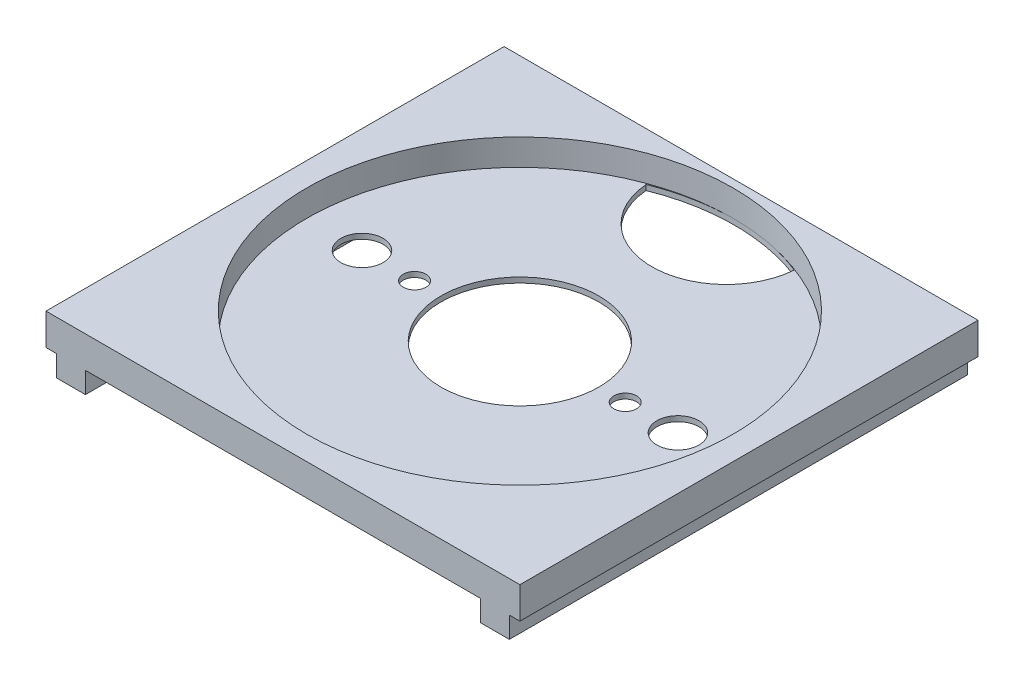
ISO-10303-21;
HEADER;
FILE_DESCRIPTION(('STEP AP214'),'2;1');
FILE_NAME('part.step','',(''),(''),'','','');
FILE_SCHEMA(('AUTOMOTIVE_DESIGN { 1 0 10303 214 1 1 1 1 }'));
ENDSEC;
DATA;
#1=APPLICATION_CONTEXT('core data for automotive mechanical design processes');
#2=APPLICATION_PROTOCOL_DEFINITION('international standard','automotive_design',2000,#1);
#3=PRODUCT_CONTEXT('',#1,'mechanical');
#4=PRODUCT('Part','Part','',(#3));
#5=PRODUCT_RELATED_PRODUCT_CATEGORY('part','',(#4));
#6=PRODUCT_DEFINITION_FORMATION('','',#4);
#7=PRODUCT_DEFINITION_CONTEXT('part definition',#1,'design');
#8=PRODUCT_DEFINITION('design','',#6,#7);
#9=PRODUCT_DEFINITION_SHAPE('','',#8);
#10=(LENGTH_UNIT() NAMED_UNIT(*) SI_UNIT(.MILLI.,.METRE.));
#11=(NAMED_UNIT(*) PLANE_ANGLE_UNIT() SI_UNIT($,.RADIAN.));
#12=(NAMED_UNIT(*) SI_UNIT($,.STERADIAN.) SOLID_ANGLE_UNIT());
#13=UNCERTAINTY_MEASURE_WITH_UNIT(LENGTH_MEASURE(1.E-05),#10,'distance_accuracy_value','');
#14=(GEOMETRIC_REPRESENTATION_CONTEXT(3) GLOBAL_UNCERTAINTY_ASSIGNED_CONTEXT((#13)) GLOBAL_UNIT_ASSIGNED_CONTEXT((#10,
#11,#12)) REPRESENTATION_CONTEXT('',''));
#15=CARTESIAN_POINT('',(0.,0.,0.));
#16=DIRECTION('',(0.,0.,1.));
#17=DIRECTION('',(1.,0.,0.));
#18=AXIS2_PLACEMENT_3D('',#15,#16,#17);
#19=CARTESIAN_POINT('',(0.,5.,0.));
#20=DIRECTION('',(0.,1.,0.));
#21=DIRECTION('',(0.,0.,1.));
#22=AXIS2_PLACEMENT_3D('',#19,#20,#21);
#23=CYLINDRICAL_SURFACE('',#22,40.5);
#24=CARTESIAN_POINT('',(0.,5.,0.));
#25=DIRECTION('',(0.,1.,0.));
#26=DIRECTION('',(0.,0.,1.));
#27=AXIS2_PLACEMENT_3D('',#24,#25,#26);
#28=CIRCLE('',#27,40.5);
#29=CARTESIAN_POINT('',(7.96690062199776,5.,-39.7086702683332));
#30=VERTEX_POINT('',#29);
#31=CARTESIAN_POINT('',(-0.453204015702651,5.,-40.4974641937017));
#32=VERTEX_POINT('',#31);
#33=EDGE_CURVE('E285',#30,#32,#28,.T.);
#34=ORIENTED_EDGE('',*,*,#33,.F.);
#35=EDGE_CURVE('E202',#32,#30,#28,.T.);
#36=ORIENTED_EDGE('',*,*,#35,.F.);
#37=EDGE_LOOP('',(#34,#36));
#38=FACE_BOUND('',#37,.T.);
#39=CARTESIAN_POINT('',(0.,10.,0.));
#40=DIRECTION('',(0.,1.,0.));
#41=DIRECTION('',(0.,0.,1.));
#42=AXIS2_PLACEMENT_3D('',#39,#40,#41);
#43=CIRCLE('',#42,40.5);
#44=CARTESIAN_POINT('',(0.,10.,40.5));
#45=VERTEX_POINT('',#44);
#46=EDGE_CURVE('E169',#45,#45,#43,.T.);
#47=ORIENTED_EDGE('',*,*,#46,.T.);
#48=EDGE_LOOP('',(#47));
#49=FACE_BOUND('',#48,.T.);
#50=ADVANCED_FACE('F41',(#38,#49),#23,.F.);
#51=CARTESIAN_POINT('',(20.,3.,0.));
#52=DIRECTION('',(0.,1.,0.));
#53=DIRECTION('',(0.,0.,1.));
#54=AXIS2_PLACEMENT_3D('',#51,#52,#53);
#55=CYLINDRICAL_SURFACE('',#54,2.15);
#56=CARTESIAN_POINT('',(20.,5.,0.));
#57=DIRECTION('',(0.,1.,0.));
#58=DIRECTION('',(0.,0.,1.));
#59=AXIS2_PLACEMENT_3D('',#56,#57,#58);
#60=CIRCLE('',#59,2.15);
#61=CARTESIAN_POINT('',(20.,5.,2.15));
#62=VERTEX_POINT('',#61);
#63=EDGE_CURVE('E294',#62,#62,#60,.T.);
#64=ORIENTED_EDGE('',*,*,#63,.T.);
#65=EDGE_LOOP('',(#64));
#66=FACE_BOUND('',#65,.T.);
#67=CARTESIAN_POINT('',(20.,4.,0.));
#68=DIRECTION('',(0.,-1.,0.));
#69=DIRECTION('',(0.,0.,-1.));
#70=AXIS2_PLACEMENT_3D('',#67,#68,#69);
#71=CIRCLE('',#70,2.15);
#72=CARTESIAN_POINT('',(20.,4.,-2.15));
#73=VERTEX_POINT('',#72);
#74=EDGE_CURVE('E268',#73,#73,#71,.F.);
#75=ORIENTED_EDGE('',*,*,#74,.F.);
#76=EDGE_LOOP('',(#75));
#77=FACE_BOUND('',#76,.T.);
#78=ADVANCED_FACE('F355',(#66,#77),#55,.F.);
#79=CARTESIAN_POINT('',(-20.,3.,0.));
#80=DIRECTION('',(0.,1.,0.));
#81=DIRECTION('',(0.,0.,1.));
#82=AXIS2_PLACEMENT_3D('',#79,#80,#81);
#83=CYLINDRICAL_SURFACE('',#82,2.15);
#84=CARTESIAN_POINT('',(-20.,5.,0.));
#85=DIRECTION('',(0.,1.,0.));
#86=DIRECTION('',(0.,0.,1.));
#87=AXIS2_PLACEMENT_3D('',#84,#85,#86);
#88=CIRCLE('',#87,2.15);
#89=CARTESIAN_POINT('',(-20.,5.,2.15));
#90=VERTEX_POINT('',#89);
#91=EDGE_CURVE('E291',#90,#90,#88,.T.);
#92=ORIENTED_EDGE('',*,*,#91,.T.);
#93=EDGE_LOOP('',(#92));
#94=FACE_BOUND('',#93,.T.);
#95=CARTESIAN_POINT('',(-20.,4.,0.));
#96=DIRECTION('',(0.,-1.,0.));
#97=DIRECTION('',(0.,0.,-1.));
#98=AXIS2_PLACEMENT_3D('',#95,#96,#97);
#99=CIRCLE('',#98,2.15);
#100=CARTESIAN_POINT('',(-20.,4.,-2.15));
#101=VERTEX_POINT('',#100);
#102=EDGE_CURVE('E206',#101,#101,#99,.F.);
#103=ORIENTED_EDGE('',*,*,#102,.F.);
#104=EDGE_LOOP('',(#103));
#105=FACE_BOUND('',#104,.T.);
#106=ADVANCED_FACE('F541',(#94,#105),#83,.F.);
#107=CARTESIAN_POINT('',(0.,0.,0.));
#108=DIRECTION('',(0.,1.,0.));
#109=DIRECTION('',(0.,0.,1.));
#110=AXIS2_PLACEMENT_3D('',#107,#108,#109);
#111=CYLINDRICAL_SURFACE('',#110,15.);
#112=CARTESIAN_POINT('',(0.,5.,0.));
#113=DIRECTION('',(0.,1.,0.));
#114=DIRECTION('',(0.,0.,1.));
#115=AXIS2_PLACEMENT_3D('',#112,#113,#114);
#116=CIRCLE('',#115,15.);
#117=CARTESIAN_POINT('',(0.,5.,15.));
#118=VERTEX_POINT('',#117);
#119=EDGE_CURVE('E288',#118,#118,#116,.T.);
#120=ORIENTED_EDGE('',*,*,#119,.T.);
#121=EDGE_LOOP('',(#120));
#122=FACE_BOUND('',#121,.T.);
#123=CARTESIAN_POINT('',(0.,4.,0.));
#124=DIRECTION('',(0.,-1.,0.));
#125=DIRECTION('',(0.,0.,-1.));
#126=AXIS2_PLACEMENT_3D('',#123,#124,#125);
#127=CIRCLE('',#126,15.);
#128=CARTESIAN_POINT('',(0.,4.,-15.));
#129=VERTEX_POINT('',#128);
#130=EDGE_CURVE('E203',#129,#129,#127,.F.);
#131=ORIENTED_EDGE('',*,*,#130,.F.);
#132=EDGE_LOOP('',(#131));
#133=FACE_BOUND('',#132,.T.);
#134=ADVANCED_FACE('F376',(#122,#133),#111,.F.);
#135=CARTESIAN_POINT('',(30.0323396507021,-5.,0.0225134709915971));
#136=DIRECTION('',(0.,1.,0.));
#137=DIRECTION('',(0.,0.,1.));
#138=AXIS2_PLACEMENT_3D('',#135,#136,#137);
#139=CYLINDRICAL_SURFACE('',#138,4.00000000000001);
#140=CARTESIAN_POINT('',(30.0323396507021,4.,0.0225134709915971));
#141=DIRECTION('',(0.,-1.,0.));
#142=DIRECTION('',(0.,0.,-1.));
#143=AXIS2_PLACEMENT_3D('',#140,#141,#142);
#144=CIRCLE('',#143,4.00000000000001);
#145=CARTESIAN_POINT('',(30.0323396507021,4.,-3.97748652900842));
#146=VERTEX_POINT('',#145);
#147=EDGE_CURVE('E212',#146,#146,#144,.T.);
#148=ORIENTED_EDGE('',*,*,#147,.T.);
#149=EDGE_LOOP('',(#148));
#150=FACE_BOUND('',#149,.T.);
#151=CARTESIAN_POINT('',(30.0323396507021,5.,0.0225134709915971));
#152=DIRECTION('',(0.,1.,0.));
#153=DIRECTION('',(0.,0.,1.));
#154=AXIS2_PLACEMENT_3D('',#151,#152,#153);
#155=CIRCLE('',#154,4.00000000000001);
#156=CARTESIAN_POINT('',(30.0323396507021,5.,4.02251347099161));
#157=VERTEX_POINT('',#156);
#158=EDGE_CURVE('E208',#157,#157,#155,.T.);
#159=ORIENTED_EDGE('',*,*,#158,.T.);
#160=EDGE_LOOP('',(#159));
#161=FACE_BOUND('',#160,.T.);
#162=ADVANCED_FACE('F322',(#150,#161),#139,.F.);
#163=CARTESIAN_POINT('',(0.234545087504077,5.,-20.721427314011));
#164=DIRECTION('',(0.,1.,0.));
#165=DIRECTION('',(0.,0.,1.));
#166=AXIS2_PLACEMENT_3D('',#163,#164,#165);
#167=PLANE('',#166);
#168=CARTESIAN_POINT('',(0.234545087504078,5.,-2.50368837224554));
#169=DIRECTION('',(0.,-1.,0.));
#170=DIRECTION('',(0.,0.,-1.));
#171=AXIS2_PLACEMENT_3D('',#168,#169,#170);
#172=CIRCLE('',#171,38.0000000000004);
#173=EDGE_CURVE('E211',#32,#30,#172,.T.);
#174=ORIENTED_EDGE('',*,*,#173,.T.);
#175=ORIENTED_EDGE('',*,*,#33,.T.);
#176=EDGE_LOOP('',(#174,#175));
#177=FACE_BOUND('',#176,.T.);
#178=ADVANCED_FACE('F351',(#177),#167,.F.);
#179=CARTESIAN_POINT('',(0.,5.,0.));
#180=DIRECTION('',(0.,1.,0.));
#181=DIRECTION('',(0.,0.,1.));
#182=AXIS2_PLACEMENT_3D('',#179,#180,#181);
#183=PLANE('',#182);
#184=CARTESIAN_POINT('',(-29.9676603492979,5.,0.0225134709915971));
#185=DIRECTION('',(0.,1.,0.));
#186=DIRECTION('',(0.,0.,1.));
#187=AXIS2_PLACEMENT_3D('',#184,#185,#186);
#188=CIRCLE('',#187,4.);
#189=CARTESIAN_POINT('',(-29.9676603492979,5.,4.0225134709916));
#190=VERTEX_POINT('',#189);
#191=EDGE_CURVE('E213',#190,#190,#188,.T.);
#192=ORIENTED_EDGE('',*,*,#191,.F.);
#193=EDGE_LOOP('',(#192));
#194=FACE_BOUND('',#193,.T.);
#195=ORIENTED_EDGE('',*,*,#158,.F.);
#196=EDGE_LOOP('',(#195));
#197=FACE_BOUND('',#196,.T.);
#198=ORIENTED_EDGE('',*,*,#119,.F.);
#199=EDGE_LOOP('',(#198));
#200=FACE_BOUND('',#199,.T.);
#201=ORIENTED_EDGE('',*,*,#91,.F.);
#202=EDGE_LOOP('',(#201));
#203=FACE_BOUND('',#202,.T.);
#204=ORIENTED_EDGE('',*,*,#63,.F.);
#205=EDGE_LOOP('',(#204));
#206=FACE_BOUND('',#205,.T.);
#207=CARTESIAN_POINT('',(0.234545087504076,5.,-38.9391662557764));
#208=DIRECTION('',(0.,1.,0.));
#209=DIRECTION('',(0.,0.,1.));
#210=AXIS2_PLACEMENT_3D('',#207,#208,#209);
#211=CIRCLE('',#210,14.1220477581371);
#212=CARTESIAN_POINT('',(-13.8415216151434,5.,-37.800491997824));
#213=VERTEX_POINT('',#212);
#214=CARTESIAN_POINT('',(14.3106117901516,5.,-37.800491997824));
#215=VERTEX_POINT('',#214);
#216=EDGE_CURVE('E278',#213,#215,#211,.T.);
#217=ORIENTED_EDGE('',*,*,#216,.F.);
#218=EDGE_CURVE('E282',#213,#32,#172,.T.);
#219=ORIENTED_EDGE('',*,*,#218,.T.);
#220=ORIENTED_EDGE('',*,*,#35,.T.);
#221=CARTESIAN_POINT('',(0.234545087504078,5.,-2.50368837224554));
#222=DIRECTION('',(0.,1.,0.));
#223=DIRECTION('',(0.,0.,1.));
#224=AXIS2_PLACEMENT_3D('',#221,#222,#223);
#225=CIRCLE('',#224,38.0000000000004);
#226=EDGE_CURVE('E198',#30,#215,#225,.F.);
#227=ORIENTED_EDGE('',*,*,#226,.T.);
#228=EDGE_LOOP('',(#217,#219,#220,#227));
#229=FACE_BOUND('',#228,.T.);
#230=ADVANCED_FACE('F345',(#194,#197,#200,#203,#206,#229),#183,.T.);
#231=CARTESIAN_POINT('',(0.234545087504078,-61.,-2.50368837224554));
#232=DIRECTION('',(0.,1.,0.));
#233=DIRECTION('',(0.,0.,1.));
#234=AXIS2_PLACEMENT_3D('',#231,#232,#233);
#235=CYLINDRICAL_SURFACE('',#234,38.0000000000004);
#236=DIRECTION('',(0.,1.,0.));
#237=VECTOR('',#236,1.);
#238=CARTESIAN_POINT('',(-13.8415216151434,-61.,-37.800491997824));
#239=LINE('',#238,#237);
#240=CARTESIAN_POINT('',(-13.8415216151434,4.00000000000007,-37.800491997824));
#241=VERTEX_POINT('',#240);
#242=EDGE_CURVE('E281',#241,#213,#239,.T.);
#243=ORIENTED_EDGE('',*,*,#242,.F.);
#244=CARTESIAN_POINT('',(0.234545087504078,4.00000000000012,-2.50368837224554));
#245=DIRECTION('',(0.,-1.,0.));
#246=DIRECTION('',(1.,0.,0.));
#247=AXIS2_PLACEMENT_3D('',#244,#245,#246);
#248=CIRCLE('',#247,38.0000000000004);
#249=CARTESIAN_POINT('',(14.3106117901516,4.00000000000025,-37.800491997824));
#250=VERTEX_POINT('',#249);
#251=EDGE_CURVE('E201',#241,#250,#248,.T.);
#252=ORIENTED_EDGE('',*,*,#251,.T.);
#253=DIRECTION('',(0.,1.,0.));
#254=VECTOR('',#253,1.);
#255=CARTESIAN_POINT('',(14.3106117901516,-61.,-37.800491997824));
#256=LINE('',#255,#254);
#257=EDGE_CURVE('E222',#250,#215,#256,.T.);
#258=ORIENTED_EDGE('',*,*,#257,.T.);
#259=ORIENTED_EDGE('',*,*,#226,.F.);
#260=ORIENTED_EDGE('',*,*,#173,.F.);
#261=ORIENTED_EDGE('',*,*,#218,.F.);
#262=EDGE_LOOP('',(#243,#252,#258,#259,#260,#261));
#263=FACE_BOUND('',#262,.T.);
#264=ADVANCED_FACE('F339',(#263),#235,.F.);
#265=CARTESIAN_POINT('',(0.234545087504076,-61.,-38.9391662557764));
#266=DIRECTION('',(0.,1.,0.));
#267=DIRECTION('',(0.,0.,1.));
#268=AXIS2_PLACEMENT_3D('',#265,#266,#267);
#269=CYLINDRICAL_SURFACE('',#268,14.1220477581371);
#270=CARTESIAN_POINT('',(0.234545087504076,4.00000000000012,-38.9391662557764));
#271=DIRECTION('',(0.,-1.,0.));
#272=DIRECTION('',(1.,0.,0.));
#273=AXIS2_PLACEMENT_3D('',#270,#271,#272);
#274=CIRCLE('',#273,14.1220477581371);
#275=EDGE_CURVE('E217',#241,#250,#274,.F.);
#276=ORIENTED_EDGE('',*,*,#275,.F.);
#277=ORIENTED_EDGE('',*,*,#242,.T.);
#278=ORIENTED_EDGE('',*,*,#216,.T.);
#279=ORIENTED_EDGE('',*,*,#257,.F.);
#280=EDGE_LOOP('',(#276,#277,#278,#279));
#281=FACE_BOUND('',#280,.T.);
#282=ADVANCED_FACE('F341',(#281),#269,.F.);
#283=CARTESIAN_POINT('',(-29.9676603492979,-5.,0.0225134709915971));
#284=DIRECTION('',(0.,1.,0.));
#285=DIRECTION('',(0.,0.,1.));
#286=AXIS2_PLACEMENT_3D('',#283,#284,#285);
#287=CYLINDRICAL_SURFACE('',#286,4.);
#288=CARTESIAN_POINT('',(-29.9676603492979,4.,0.0225134709915971));
#289=DIRECTION('',(0.,-1.,0.));
#290=DIRECTION('',(0.,0.,-1.));
#291=AXIS2_PLACEMENT_3D('',#288,#289,#290);
#292=CIRCLE('',#291,4.);
#293=CARTESIAN_POINT('',(-29.9676603492979,4.,-3.9774865290084));
#294=VERTEX_POINT('',#293);
#295=EDGE_CURVE('E216',#294,#294,#292,.T.);
#296=ORIENTED_EDGE('',*,*,#295,.T.);
#297=EDGE_LOOP('',(#296));
#298=FACE_BOUND('',#297,.T.);
#299=ORIENTED_EDGE('',*,*,#191,.T.);
#300=EDGE_LOOP('',(#299));
#301=FACE_BOUND('',#300,.T.);
#302=ADVANCED_FACE('F360',(#298,#301),#287,.F.);
#303=CARTESIAN_POINT('',(0.,10.,0.));
#304=DIRECTION('',(0.,-1.,0.));
#305=DIRECTION('',(0.,0.,-1.));
#306=AXIS2_PLACEMENT_3D('',#303,#304,#305);
#307=PLANE('',#306);
#308=ORIENTED_EDGE('',*,*,#46,.F.);
#309=EDGE_LOOP('',(#308));
#310=FACE_BOUND('',#309,.T.);
#311=DIRECTION('',(0.,0.,-1.));
#312=VECTOR('',#311,1.);
#313=CARTESIAN_POINT('',(45.,10.,-45.));
#314=LINE('',#313,#312);
#315=CARTESIAN_POINT('',(45.,10.,45.));
#316=VERTEX_POINT('',#315);
#317=CARTESIAN_POINT('',(45.,10.,-42.));
#318=VERTEX_POINT('',#317);
#319=EDGE_CURVE('E177',#316,#318,#314,.T.);
#320=ORIENTED_EDGE('',*,*,#319,.T.);
#321=DIRECTION('',(-1.,0.,0.));
#322=VECTOR('',#321,1.);
#323=CARTESIAN_POINT('',(45.,10.,-42.));
#324=LINE('',#323,#322);
#325=CARTESIAN_POINT('',(-45.,10.,-42.));
#326=VERTEX_POINT('',#325);
#327=EDGE_CURVE('E159',#318,#326,#324,.T.);
#328=ORIENTED_EDGE('',*,*,#327,.T.);
#329=DIRECTION('',(0.,0.,1.));
#330=VECTOR('',#329,1.);
#331=CARTESIAN_POINT('',(-45.,10.,45.));
#332=LINE('',#331,#330);
#333=CARTESIAN_POINT('',(-45.,10.,45.));
#334=VERTEX_POINT('',#333);
#335=EDGE_CURVE('E189',#326,#334,#332,.T.);
#336=ORIENTED_EDGE('',*,*,#335,.T.);
#337=DIRECTION('',(1.,0.,0.));
#338=VECTOR('',#337,1.);
#339=CARTESIAN_POINT('',(0.,10.,45.));
#340=LINE('',#339,#338);
#341=EDGE_CURVE('E183',#334,#316,#340,.T.);
#342=ORIENTED_EDGE('',*,*,#341,.T.);
#343=EDGE_LOOP('',(#320,#328,#336,#342));
#344=FACE_BOUND('',#343,.T.);
#345=ADVANCED_FACE('F181',(#310,#344),#307,.F.);
#346=CARTESIAN_POINT('',(-45.,10.,45.));
#347=DIRECTION('',(1.,0.,0.));
#348=DIRECTION('',(0.,0.,-1.));
#349=AXIS2_PLACEMENT_3D('',#346,#347,#348);
#350=PLANE('',#349);
#351=ORIENTED_EDGE('',*,*,#335,.F.);
#352=DIRECTION('',(0.,1.,0.));
#353=VECTOR('',#352,1.);
#354=CARTESIAN_POINT('',(-45.,0.,-42.));
#355=LINE('',#354,#353);
#356=CARTESIAN_POINT('',(-45.,4.,-42.));
#357=VERTEX_POINT('',#356);
#358=EDGE_CURVE('E165',#357,#326,#355,.T.);
#359=ORIENTED_EDGE('',*,*,#358,.F.);
#360=DIRECTION('',(0.,0.,1.));
#361=VECTOR('',#360,1.);
#362=CARTESIAN_POINT('',(-45.,4.,-42.));
#363=LINE('',#362,#361);
#364=CARTESIAN_POINT('',(-45.,4.,45.));
#365=VERTEX_POINT('',#364);
#366=EDGE_CURVE('E185',#357,#365,#363,.T.);
#367=ORIENTED_EDGE('',*,*,#366,.T.);
#368=DIRECTION('',(0.,-1.,0.));
#369=VECTOR('',#368,1.);
#370=CARTESIAN_POINT('',(-45.,10.,45.));
#371=LINE('',#370,#369);
#372=EDGE_CURVE('E194',#334,#365,#371,.T.);
#373=ORIENTED_EDGE('',*,*,#372,.F.);
#374=EDGE_LOOP('',(#351,#359,#367,#373));
#375=FACE_BOUND('',#374,.T.);
#376=ADVANCED_FACE('F301',(#375),#350,.F.);
#377=CARTESIAN_POINT('',(45.,10.,-45.));
#378=DIRECTION('',(-1.,0.,0.));
#379=DIRECTION('',(0.,0.,1.));
#380=AXIS2_PLACEMENT_3D('',#377,#378,#379);
#381=PLANE('',#380);
#382=DIRECTION('',(0.,0.,1.));
#383=VECTOR('',#382,1.);
#384=CARTESIAN_POINT('',(45.,4.00000000000032,-42.));
#385=LINE('',#384,#383);
#386=CARTESIAN_POINT('',(45.,4.00000000000031,-42.));
#387=VERTEX_POINT('',#386);
#388=CARTESIAN_POINT('',(45.,4.00000000000032,45.));
#389=VERTEX_POINT('',#388);
#390=EDGE_CURVE('E178',#387,#389,#385,.T.);
#391=ORIENTED_EDGE('',*,*,#390,.F.);
#392=DIRECTION('',(0.,1.,0.));
#393=VECTOR('',#392,1.);
#394=CARTESIAN_POINT('',(45.,0.,-42.));
#395=LINE('',#394,#393);
#396=EDGE_CURVE('E162',#387,#318,#395,.T.);
#397=ORIENTED_EDGE('',*,*,#396,.T.);
#398=ORIENTED_EDGE('',*,*,#319,.F.);
#399=DIRECTION('',(0.,-1.,0.));
#400=VECTOR('',#399,1.);
#401=CARTESIAN_POINT('',(45.,10.,45.));
#402=LINE('',#401,#400);
#403=EDGE_CURVE('E187',#316,#389,#402,.T.);
#404=ORIENTED_EDGE('',*,*,#403,.T.);
#405=EDGE_LOOP('',(#391,#397,#398,#404));
#406=FACE_BOUND('',#405,.T.);
#407=ADVANCED_FACE('F175',(#406),#381,.F.);
#408=CARTESIAN_POINT('',(45.,10.,45.));
#409=DIRECTION('',(0.,0.,-1.));
#410=DIRECTION('',(-1.,0.,0.));
#411=AXIS2_PLACEMENT_3D('',#408,#409,#410);
#412=PLANE('',#411);
#413=ORIENTED_EDGE('',*,*,#372,.T.);
#414=DIRECTION('',(-1.,0.,0.));
#415=VECTOR('',#414,1.);
#416=CARTESIAN_POINT('',(-43.,4.,45.));
#417=LINE('',#416,#415);
#418=CARTESIAN_POINT('',(-43.,4.,45.));
#419=VERTEX_POINT('',#418);
#420=EDGE_CURVE('E96',#419,#365,#417,.T.);
#421=ORIENTED_EDGE('',*,*,#420,.F.);
#422=DIRECTION('',(0.,-1.,0.));
#423=VECTOR('',#422,1.);
#424=CARTESIAN_POINT('',(-43.,4.,45.));
#425=LINE('',#424,#423);
#426=CARTESIAN_POINT('',(-43.,0.,45.));
#427=VERTEX_POINT('',#426);
#428=EDGE_CURVE('E197',#419,#427,#425,.T.);
#429=ORIENTED_EDGE('',*,*,#428,.T.);
#430=DIRECTION('',(1.,0.,0.));
#431=VECTOR('',#430,1.);
#432=CARTESIAN_POINT('',(-43.,0.,45.));
#433=LINE('',#432,#431);
#434=CARTESIAN_POINT('',(-37.5165528603111,0.,45.));
#435=VERTEX_POINT('',#434);
#436=EDGE_CURVE('E244',#427,#435,#433,.T.);
#437=ORIENTED_EDGE('',*,*,#436,.T.);
#438=DIRECTION('',(0.,1.,0.));
#439=VECTOR('',#438,1.);
#440=CARTESIAN_POINT('',(-37.5165528603111,0.,45.));
#441=LINE('',#440,#439);
#442=CARTESIAN_POINT('',(-37.5165528603111,4.,45.));
#443=VERTEX_POINT('',#442);
#444=EDGE_CURVE('E247',#435,#443,#441,.T.);
#445=ORIENTED_EDGE('',*,*,#444,.T.);
#446=DIRECTION('',(1.,0.,0.));
#447=VECTOR('',#446,1.);
#448=CARTESIAN_POINT('',(-37.5165528603111,4.,45.));
#449=LINE('',#448,#447);
#450=CARTESIAN_POINT('',(37.5165528603111,4.00000000000026,45.));
#451=VERTEX_POINT('',#450);
#452=EDGE_CURVE('E250',#443,#451,#449,.T.);
#453=ORIENTED_EDGE('',*,*,#452,.T.);
#454=DIRECTION('',(0.,1.,0.));
#455=VECTOR('',#454,1.);
#456=CARTESIAN_POINT('',(37.5165528603112,2.60208521396521E-13,45.));
#457=LINE('',#456,#455);
#458=CARTESIAN_POINT('',(37.5165528603112,2.60208521396521E-13,45.));
#459=VERTEX_POINT('',#458);
#460=EDGE_CURVE('E229',#459,#451,#457,.T.);
#461=ORIENTED_EDGE('',*,*,#460,.F.);
#462=DIRECTION('',(-1.,0.,0.));
#463=VECTOR('',#462,1.);
#464=CARTESIAN_POINT('',(43.,2.98372437868011E-13,45.));
#465=LINE('',#464,#463);
#466=CARTESIAN_POINT('',(43.,2.98372437868011E-13,45.));
#467=VERTEX_POINT('',#466);
#468=EDGE_CURVE('E225',#467,#459,#465,.T.);
#469=ORIENTED_EDGE('',*,*,#468,.F.);
#470=DIRECTION('',(0.,-1.,0.));
#471=VECTOR('',#470,1.);
#472=CARTESIAN_POINT('',(43.,4.0000000000003,45.));
#473=LINE('',#472,#471);
#474=CARTESIAN_POINT('',(43.,4.0000000000003,45.));
#475=VERTEX_POINT('',#474);
#476=EDGE_CURVE('E226',#475,#467,#473,.T.);
#477=ORIENTED_EDGE('',*,*,#476,.F.);
#478=DIRECTION('',(1.,0.,0.));
#479=VECTOR('',#478,1.);
#480=CARTESIAN_POINT('',(43.,4.0000000000003,45.));
#481=LINE('',#480,#479);
#482=EDGE_CURVE('E207',#475,#389,#481,.T.);
#483=ORIENTED_EDGE('',*,*,#482,.T.);
#484=ORIENTED_EDGE('',*,*,#403,.F.);
#485=ORIENTED_EDGE('',*,*,#341,.F.);
#486=EDGE_LOOP('',(#413,#421,#429,#437,#445,#453,#461,#469,#477,#483,#484,#485));
#487=FACE_BOUND('',#486,.T.);
#488=ADVANCED_FACE('F303',(#487),#412,.F.);
#489=CARTESIAN_POINT('',(-35.,4.,-23.));
#490=DIRECTION('',(0.,-1.,0.));
#491=DIRECTION('',(0.,0.,-1.));
#492=AXIS2_PLACEMENT_3D('',#489,#490,#491);
#493=PLANE('',#492);
#494=DIRECTION('',(0.,0.,1.));
#495=VECTOR('',#494,1.);
#496=CARTESIAN_POINT('',(37.5165528603111,4.00000000000026,-42.));
#497=LINE('',#496,#495);
#498=CARTESIAN_POINT('',(37.5165528603111,4.,-42.));
#499=VERTEX_POINT('',#498);
#500=EDGE_CURVE('E219',#499,#451,#497,.T.);
#501=ORIENTED_EDGE('',*,*,#500,.T.);
#502=ORIENTED_EDGE('',*,*,#452,.F.);
#503=DIRECTION('',(0.,0.,1.));
#504=VECTOR('',#503,1.);
#505=CARTESIAN_POINT('',(-37.5165528603111,4.,-42.));
#506=LINE('',#505,#504);
#507=CARTESIAN_POINT('',(-37.5165528603111,4.,-42.));
#508=VERTEX_POINT('',#507);
#509=EDGE_CURVE('E236',#508,#443,#506,.T.);
#510=ORIENTED_EDGE('',*,*,#509,.F.);
#511=DIRECTION('',(1.,0.,0.));
#512=VECTOR('',#511,1.);
#513=CARTESIAN_POINT('',(-37.5165528603111,4.,-42.));
#514=LINE('',#513,#512);
#515=EDGE_CURVE('E235',#508,#499,#514,.T.);
#516=ORIENTED_EDGE('',*,*,#515,.T.);
#517=EDGE_LOOP('',(#501,#502,#510,#516));
#518=FACE_BOUND('',#517,.T.);
#519=ORIENTED_EDGE('',*,*,#295,.F.);
#520=EDGE_LOOP('',(#519));
#521=FACE_BOUND('',#520,.T.);
#522=ORIENTED_EDGE('',*,*,#147,.F.);
#523=EDGE_LOOP('',(#522));
#524=FACE_BOUND('',#523,.T.);
#525=ORIENTED_EDGE('',*,*,#130,.T.);
#526=EDGE_LOOP('',(#525));
#527=FACE_BOUND('',#526,.T.);
#528=ORIENTED_EDGE('',*,*,#102,.T.);
#529=EDGE_LOOP('',(#528));
#530=FACE_BOUND('',#529,.T.);
#531=ORIENTED_EDGE('',*,*,#74,.T.);
#532=EDGE_LOOP('',(#531));
#533=FACE_BOUND('',#532,.T.);
#534=ORIENTED_EDGE('',*,*,#275,.T.);
#535=ORIENTED_EDGE('',*,*,#251,.F.);
#536=EDGE_LOOP('',(#534,#535));
#537=FACE_BOUND('',#536,.T.);
#538=ADVANCED_FACE('F325',(#518,#521,#524,#527,#530,#533,#537),#493,.T.);
#539=CARTESIAN_POINT('',(43.,4.0000000000003,-42.));
#540=DIRECTION('',(0.,-1.,0.));
#541=DIRECTION('',(1.,0.,0.));
#542=AXIS2_PLACEMENT_3D('',#539,#540,#541);
#543=PLANE('',#542);
#544=ORIENTED_EDGE('',*,*,#482,.F.);
#545=DIRECTION('',(0.,0.,1.));
#546=VECTOR('',#545,1.);
#547=CARTESIAN_POINT('',(43.,4.0000000000003,-42.));
#548=LINE('',#547,#546);
#549=CARTESIAN_POINT('',(43.,4.0000000000003,-42.));
#550=VERTEX_POINT('',#549);
#551=EDGE_CURVE('E85',#550,#475,#548,.T.);
#552=ORIENTED_EDGE('',*,*,#551,.F.);
#553=DIRECTION('',(1.,0.,0.));
#554=VECTOR('',#553,1.);
#555=CARTESIAN_POINT('',(43.,4.0000000000003,-42.));
#556=LINE('',#555,#554);
#557=EDGE_CURVE('E45',#550,#387,#556,.T.);
#558=ORIENTED_EDGE('',*,*,#557,.T.);
#559=ORIENTED_EDGE('',*,*,#390,.T.);
#560=EDGE_LOOP('',(#544,#552,#558,#559));
#561=FACE_BOUND('',#560,.T.);
#562=ADVANCED_FACE('F307',(#561),#543,.T.);
#563=CARTESIAN_POINT('',(-43.,4.,-42.));
#564=DIRECTION('',(0.,1.,0.));
#565=DIRECTION('',(0.,0.,1.));
#566=AXIS2_PLACEMENT_3D('',#563,#564,#565);
#567=PLANE('',#566);
#568=ORIENTED_EDGE('',*,*,#420,.T.);
#569=ORIENTED_EDGE('',*,*,#366,.F.);
#570=DIRECTION('',(-1.,0.,0.));
#571=VECTOR('',#570,1.);
#572=CARTESIAN_POINT('',(-43.,4.,-42.));
#573=LINE('',#572,#571);
#574=CARTESIAN_POINT('',(-43.,4.,-42.));
#575=VERTEX_POINT('',#574);
#576=EDGE_CURVE('E259',#575,#357,#573,.T.);
#577=ORIENTED_EDGE('',*,*,#576,.F.);
#578=DIRECTION('',(0.,0.,1.));
#579=VECTOR('',#578,1.);
#580=CARTESIAN_POINT('',(-43.,4.,-42.));
#581=LINE('',#580,#579);
#582=EDGE_CURVE('E93',#575,#419,#581,.T.);
#583=ORIENTED_EDGE('',*,*,#582,.T.);
#584=EDGE_LOOP('',(#568,#569,#577,#583));
#585=FACE_BOUND('',#584,.T.);
#586=ADVANCED_FACE('F43',(#585),#567,.F.);
#587=CARTESIAN_POINT('',(43.,4.0000000000003,-42.));
#588=DIRECTION('',(-1.,0.,0.));
#589=DIRECTION('',(0.,-1.,0.));
#590=AXIS2_PLACEMENT_3D('',#587,#588,#589);
#591=PLANE('',#590);
#592=ORIENTED_EDGE('',*,*,#476,.T.);
#593=DIRECTION('',(0.,0.,1.));
#594=VECTOR('',#593,1.);
#595=CARTESIAN_POINT('',(43.,2.98372437868011E-13,-42.));
#596=LINE('',#595,#594);
#597=CARTESIAN_POINT('',(43.,0.,-42.));
#598=VERTEX_POINT('',#597);
#599=EDGE_CURVE('E227',#598,#467,#596,.T.);
#600=ORIENTED_EDGE('',*,*,#599,.F.);
#601=DIRECTION('',(0.,-1.,0.));
#602=VECTOR('',#601,1.);
#603=CARTESIAN_POINT('',(43.,4.0000000000003,-42.));
#604=LINE('',#603,#602);
#605=EDGE_CURVE('E267',#550,#598,#604,.T.);
#606=ORIENTED_EDGE('',*,*,#605,.F.);
#607=ORIENTED_EDGE('',*,*,#551,.T.);
#608=EDGE_LOOP('',(#592,#600,#606,#607));
#609=FACE_BOUND('',#608,.T.);
#610=ADVANCED_FACE('F309',(#609),#591,.F.);
#611=CARTESIAN_POINT('',(43.,2.98372437868011E-13,-42.));
#612=DIRECTION('',(0.,1.,0.));
#613=DIRECTION('',(-1.,0.,0.));
#614=AXIS2_PLACEMENT_3D('',#611,#612,#613);
#615=PLANE('',#614);
#616=DIRECTION('',(0.,0.,1.));
#617=VECTOR('',#616,1.);
#618=CARTESIAN_POINT('',(37.5165528603112,2.60208521396521E-13,-42.));
#619=LINE('',#618,#617);
#620=CARTESIAN_POINT('',(37.5165528603112,0.,-42.));
#621=VERTEX_POINT('',#620);
#622=EDGE_CURVE('E230',#621,#459,#619,.T.);
#623=ORIENTED_EDGE('',*,*,#622,.F.);
#624=DIRECTION('',(-1.,0.,0.));
#625=VECTOR('',#624,1.);
#626=CARTESIAN_POINT('',(45.,0.,-42.));
#627=LINE('',#626,#625);
#628=EDGE_CURVE('E170',#598,#621,#627,.T.);
#629=ORIENTED_EDGE('',*,*,#628,.F.);
#630=ORIENTED_EDGE('',*,*,#599,.T.);
#631=ORIENTED_EDGE('',*,*,#468,.T.);
#632=EDGE_LOOP('',(#623,#629,#630,#631));
#633=FACE_BOUND('',#632,.T.);
#634=ADVANCED_FACE('F312',(#633),#615,.F.);
#635=CARTESIAN_POINT('',(37.5165528603112,2.60208521396521E-13,-42.));
#636=DIRECTION('',(1.,0.,0.));
#637=DIRECTION('',(0.,1.,0.));
#638=AXIS2_PLACEMENT_3D('',#635,#636,#637);
#639=PLANE('',#638);
#640=ORIENTED_EDGE('',*,*,#460,.T.);
#641=ORIENTED_EDGE('',*,*,#500,.F.);
#642=DIRECTION('',(0.,1.,0.));
#643=VECTOR('',#642,1.);
#644=CARTESIAN_POINT('',(37.5165528603112,2.60208521396521E-13,-42.));
#645=LINE('',#644,#643);
#646=EDGE_CURVE('E261',#621,#499,#645,.T.);
#647=ORIENTED_EDGE('',*,*,#646,.F.);
#648=ORIENTED_EDGE('',*,*,#622,.T.);
#649=EDGE_LOOP('',(#640,#641,#647,#648));
#650=FACE_BOUND('',#649,.T.);
#651=ADVANCED_FACE('F384',(#650),#639,.F.);
#652=CARTESIAN_POINT('',(-37.5165528603111,0.,-42.));
#653=DIRECTION('',(1.,0.,0.));
#654=DIRECTION('',(0.,0.,-1.));
#655=AXIS2_PLACEMENT_3D('',#652,#653,#654);
#656=PLANE('',#655);
#657=ORIENTED_EDGE('',*,*,#444,.F.);
#658=DIRECTION('',(0.,0.,1.));
#659=VECTOR('',#658,1.);
#660=CARTESIAN_POINT('',(-37.5165528603111,0.,-42.));
#661=LINE('',#660,#659);
#662=CARTESIAN_POINT('',(-37.5165528603111,0.,-42.));
#663=VERTEX_POINT('',#662);
#664=EDGE_CURVE('E238',#663,#435,#661,.T.);
#665=ORIENTED_EDGE('',*,*,#664,.F.);
#666=DIRECTION('',(0.,1.,0.));
#667=VECTOR('',#666,1.);
#668=CARTESIAN_POINT('',(-37.5165528603111,0.,-42.));
#669=LINE('',#668,#667);
#670=EDGE_CURVE('E232',#663,#508,#669,.T.);
#671=ORIENTED_EDGE('',*,*,#670,.T.);
#672=ORIENTED_EDGE('',*,*,#509,.T.);
#673=EDGE_LOOP('',(#657,#665,#671,#672));
#674=FACE_BOUND('',#673,.T.);
#675=ADVANCED_FACE('F387',(#674),#656,.T.);
#676=CARTESIAN_POINT('',(-43.,0.,-42.));
#677=DIRECTION('',(0.,-1.,0.));
#678=DIRECTION('',(0.,0.,-1.));
#679=AXIS2_PLACEMENT_3D('',#676,#677,#678);
#680=PLANE('',#679);
#681=CARTESIAN_POINT('',(-43.,0.,-42.));
#682=VERTEX_POINT('',#681);
#683=EDGE_CURVE('E179',#663,#682,#627,.T.);
#684=ORIENTED_EDGE('',*,*,#683,.F.);
#685=ORIENTED_EDGE('',*,*,#664,.T.);
#686=ORIENTED_EDGE('',*,*,#436,.F.);
#687=DIRECTION('',(0.,0.,1.));
#688=VECTOR('',#687,1.);
#689=CARTESIAN_POINT('',(-43.,0.,-42.));
#690=LINE('',#689,#688);
#691=EDGE_CURVE('E11',#682,#427,#690,.T.);
#692=ORIENTED_EDGE('',*,*,#691,.F.);
#693=EDGE_LOOP('',(#684,#685,#686,#692));
#694=FACE_BOUND('',#693,.T.);
#695=ADVANCED_FACE('F391',(#694),#680,.T.);
#696=CARTESIAN_POINT('',(-43.,4.,-42.));
#697=DIRECTION('',(-1.,0.,0.));
#698=DIRECTION('',(0.,0.,1.));
#699=AXIS2_PLACEMENT_3D('',#696,#697,#698);
#700=PLANE('',#699);
#701=ORIENTED_EDGE('',*,*,#428,.F.);
#702=ORIENTED_EDGE('',*,*,#582,.F.);
#703=DIRECTION('',(0.,-1.,0.));
#704=VECTOR('',#703,1.);
#705=CARTESIAN_POINT('',(-43.,4.,-42.));
#706=LINE('',#705,#704);
#707=EDGE_CURVE('E51',#575,#682,#706,.T.);
#708=ORIENTED_EDGE('',*,*,#707,.T.);
#709=ORIENTED_EDGE('',*,*,#691,.T.);
#710=EDGE_LOOP('',(#701,#702,#708,#709));
#711=FACE_BOUND('',#710,.T.);
#712=ADVANCED_FACE('F394',(#711),#700,.T.);
#713=CARTESIAN_POINT('',(45.,0.,-42.));
#714=DIRECTION('',(0.,0.,1.));
#715=DIRECTION('',(1.,0.,0.));
#716=AXIS2_PLACEMENT_3D('',#713,#714,#715);
#717=PLANE('',#716);
#718=ORIENTED_EDGE('',*,*,#557,.F.);
#719=ORIENTED_EDGE('',*,*,#605,.T.);
#720=ORIENTED_EDGE('',*,*,#628,.T.);
#721=ORIENTED_EDGE('',*,*,#646,.T.);
#722=ORIENTED_EDGE('',*,*,#515,.F.);
#723=ORIENTED_EDGE('',*,*,#670,.F.);
#724=ORIENTED_EDGE('',*,*,#683,.T.);
#725=ORIENTED_EDGE('',*,*,#707,.F.);
#726=ORIENTED_EDGE('',*,*,#576,.T.);
#727=ORIENTED_EDGE('',*,*,#358,.T.);
#728=ORIENTED_EDGE('',*,*,#327,.F.);
#729=ORIENTED_EDGE('',*,*,#396,.F.);
#730=EDGE_LOOP('',(#718,#719,#720,#721,#722,#723,#724,#725,#726,#727,#728,#729));
#731=FACE_BOUND('',#730,.T.);
#732=ADVANCED_FACE('F161',(#731),#717,.F.);
#733=CLOSED_SHELL('',(#50,#78,#106,#134,#162,#178,#230,#264,#282,#302,#345,#376,#407,#488,#538,
#562,#586,#610,#634,#651,#675,#695,#712,#732));
#734=MANIFOLD_SOLID_BREP('B2',#733);
#735=ADVANCED_BREP_SHAPE_REPRESENTATION('',(#18,#734),#14);
#736=SHAPE_DEFINITION_REPRESENTATION(#9,#735);
ENDSEC;
END-ISO-10303-21;
